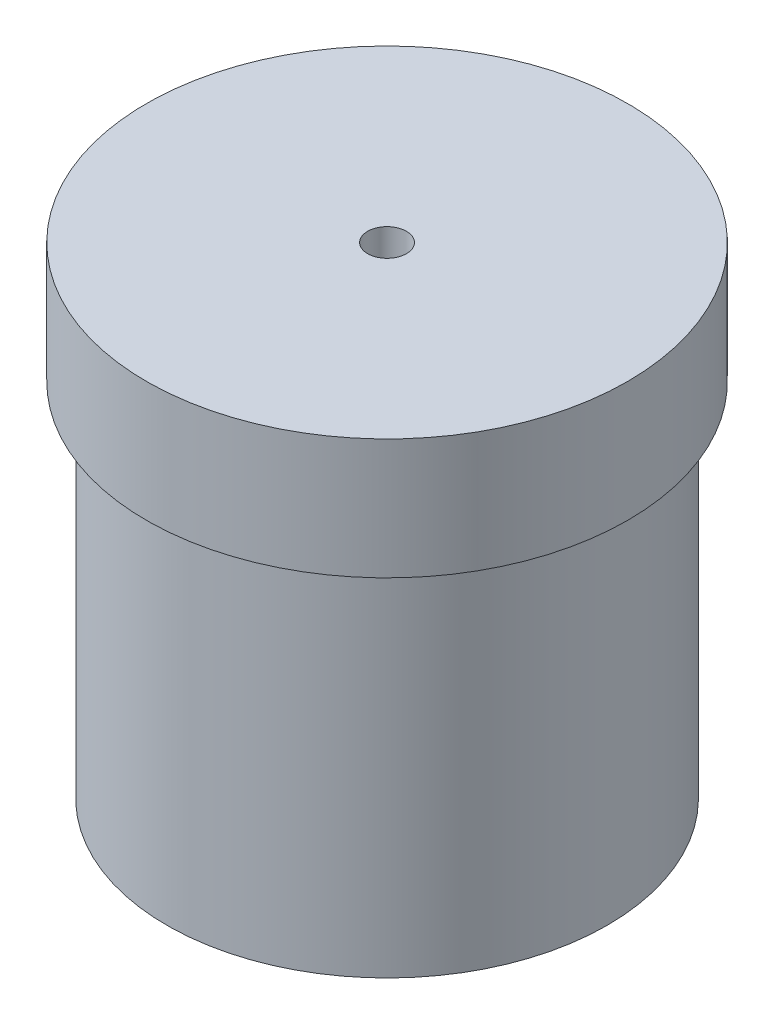
ISO-10303-21;
HEADER;
FILE_DESCRIPTION(('STEP AP214'),'2;1');
FILE_NAME('part.step','',(''),(''),'','','');
FILE_SCHEMA(('AUTOMOTIVE_DESIGN { 1 0 10303 214 1 1 1 1 }'));
ENDSEC;
DATA;
#1=APPLICATION_CONTEXT('core data for automotive mechanical design processes');
#2=APPLICATION_PROTOCOL_DEFINITION('international standard','automotive_design',2000,#1);
#3=PRODUCT_CONTEXT('',#1,'mechanical');
#4=PRODUCT('Part','Part','',(#3));
#5=PRODUCT_RELATED_PRODUCT_CATEGORY('part','',(#4));
#6=PRODUCT_DEFINITION_FORMATION('','',#4);
#7=PRODUCT_DEFINITION_CONTEXT('part definition',#1,'design');
#8=PRODUCT_DEFINITION('design','',#6,#7);
#9=PRODUCT_DEFINITION_SHAPE('','',#8);
#10=(LENGTH_UNIT() NAMED_UNIT(*) SI_UNIT(.MILLI.,.METRE.));
#11=(NAMED_UNIT(*) PLANE_ANGLE_UNIT() SI_UNIT($,.RADIAN.));
#12=(NAMED_UNIT(*) SI_UNIT($,.STERADIAN.) SOLID_ANGLE_UNIT());
#13=UNCERTAINTY_MEASURE_WITH_UNIT(LENGTH_MEASURE(1.E-05),#10,'distance_accuracy_value','');
#14=(GEOMETRIC_REPRESENTATION_CONTEXT(3) GLOBAL_UNCERTAINTY_ASSIGNED_CONTEXT((#13)) GLOBAL_UNIT_ASSIGNED_CONTEXT((#10,
#11,#12)) REPRESENTATION_CONTEXT('',''));
#15=CARTESIAN_POINT('',(0.,0.,0.));
#16=DIRECTION('',(0.,0.,1.));
#17=DIRECTION('',(1.,0.,0.));
#18=AXIS2_PLACEMENT_3D('',#15,#16,#17);
#19=CARTESIAN_POINT('',(0.,12.7,0.));
#20=DIRECTION('',(0.,-1.,0.));
#21=DIRECTION('',(1.,0.,0.));
#22=AXIS2_PLACEMENT_3D('',#19,#20,#21);
#23=PLANE('',#22);
#24=CARTESIAN_POINT('',(0.,12.7,0.));
#25=DIRECTION('',(0.,1.,0.));
#26=DIRECTION('',(0.,0.,1.));
#27=AXIS2_PLACEMENT_3D('',#24,#25,#26);
#28=CIRCLE('',#27,1.025);
#29=CARTESIAN_POINT('',(0.,12.7,1.025));
#30=VERTEX_POINT('',#29);
#31=EDGE_CURVE('E60',#30,#30,#28,.T.);
#32=ORIENTED_EDGE('',*,*,#31,.F.);
#33=EDGE_LOOP('',(#32));
#34=FACE_BOUND('',#33,.T.);
#35=CARTESIAN_POINT('',(0.,12.7,0.));
#36=DIRECTION('',(0.,-1.,0.));
#37=DIRECTION('',(1.,0.,0.));
#38=AXIS2_PLACEMENT_3D('',#35,#36,#37);
#39=CIRCLE('',#38,12.7);
#40=CARTESIAN_POINT('',(12.7,12.7,0.));
#41=VERTEX_POINT('',#40);
#42=EDGE_CURVE('E11',#41,#41,#39,.T.);
#43=ORIENTED_EDGE('',*,*,#42,.F.);
#44=EDGE_LOOP('',(#43));
#45=FACE_BOUND('',#44,.T.);
#46=ADVANCED_FACE('F40',(#34,#45),#23,.F.);
#47=CARTESIAN_POINT('',(0.,-12.7,0.));
#48=DIRECTION('',(0.,-1.,0.));
#49=DIRECTION('',(1.,0.,0.));
#50=AXIS2_PLACEMENT_3D('',#47,#48,#49);
#51=CYLINDRICAL_SURFACE('',#50,12.7);
#52=CARTESIAN_POINT('',(0.,6.35,0.));
#53=DIRECTION('',(0.,-1.,0.));
#54=DIRECTION('',(1.,0.,0.));
#55=AXIS2_PLACEMENT_3D('',#52,#53,#54);
#56=CIRCLE('',#55,12.7);
#57=CARTESIAN_POINT('',(12.7,6.35000000000001,0.));
#58=VERTEX_POINT('',#57);
#59=EDGE_CURVE('E46',#58,#58,#56,.T.);
#60=ORIENTED_EDGE('',*,*,#59,.F.);
#61=EDGE_LOOP('',(#60));
#62=FACE_BOUND('',#61,.T.);
#63=ORIENTED_EDGE('',*,*,#42,.T.);
#64=EDGE_LOOP('',(#63));
#65=FACE_BOUND('',#64,.T.);
#66=ADVANCED_FACE('F74',(#62,#65),#51,.T.);
#67=CARTESIAN_POINT('',(-12.7,6.35,0.));
#68=DIRECTION('',(0.,1.,0.));
#69=DIRECTION('',(-1.,0.,0.));
#70=AXIS2_PLACEMENT_3D('',#67,#68,#69);
#71=PLANE('',#70);
#72=CARTESIAN_POINT('',(0.,6.35,0.));
#73=DIRECTION('',(0.,-1.,0.));
#74=DIRECTION('',(1.,0.,0.));
#75=AXIS2_PLACEMENT_3D('',#72,#73,#74);
#76=CIRCLE('',#75,11.6205);
#77=CARTESIAN_POINT('',(11.6205,6.35,0.));
#78=VERTEX_POINT('',#77);
#79=EDGE_CURVE('E63',#78,#78,#76,.T.);
#80=ORIENTED_EDGE('',*,*,#79,.F.);
#81=EDGE_LOOP('',(#80));
#82=FACE_BOUND('',#81,.T.);
#83=ORIENTED_EDGE('',*,*,#59,.T.);
#84=EDGE_LOOP('',(#83));
#85=FACE_BOUND('',#84,.T.);
#86=ADVANCED_FACE('F72',(#82,#85),#71,.F.);
#87=CARTESIAN_POINT('',(0.,-12.7,0.));
#88=DIRECTION('',(0.,-1.,0.));
#89=DIRECTION('',(1.,0.,0.));
#90=AXIS2_PLACEMENT_3D('',#87,#88,#89);
#91=CYLINDRICAL_SURFACE('',#90,11.6205);
#92=CARTESIAN_POINT('',(0.,-12.7,0.));
#93=DIRECTION('',(0.,-1.,0.));
#94=DIRECTION('',(1.,0.,0.));
#95=AXIS2_PLACEMENT_3D('',#92,#93,#94);
#96=CIRCLE('',#95,11.6205);
#97=CARTESIAN_POINT('',(11.6205,-12.7,0.));
#98=VERTEX_POINT('',#97);
#99=EDGE_CURVE('E59',#98,#98,#96,.T.);
#100=ORIENTED_EDGE('',*,*,#99,.F.);
#101=EDGE_LOOP('',(#100));
#102=FACE_BOUND('',#101,.T.);
#103=ORIENTED_EDGE('',*,*,#79,.T.);
#104=EDGE_LOOP('',(#103));
#105=FACE_BOUND('',#104,.T.);
#106=ADVANCED_FACE('F92',(#102,#105),#91,.T.);
#107=CARTESIAN_POINT('',(-11.6205,-12.7,0.));
#108=DIRECTION('',(0.,1.,0.));
#109=DIRECTION('',(-1.,0.,0.));
#110=AXIS2_PLACEMENT_3D('',#107,#108,#109);
#111=PLANE('',#110);
#112=ORIENTED_EDGE('',*,*,#99,.T.);
#113=EDGE_LOOP('',(#112));
#114=FACE_BOUND('',#113,.T.);
#115=ADVANCED_FACE('F53',(#114),#111,.F.);
#116=CARTESIAN_POINT('',(0.,6.35,0.));
#117=DIRECTION('',(0.,1.,0.));
#118=DIRECTION('',(0.,0.,1.));
#119=AXIS2_PLACEMENT_3D('',#116,#117,#118);
#120=CONICAL_SURFACE('',#119,1.025,1.02974425867665);
#121=CARTESIAN_POINT('',(0.,5.73411786549676,0.));
#122=VERTEX_POINT('',#121);
#123=VERTEX_LOOP('',#122);
#124=FACE_BOUND('',#123,.T.);
#125=CARTESIAN_POINT('',(0.,6.35,0.));
#126=DIRECTION('',(0.,1.,0.));
#127=DIRECTION('',(0.,0.,1.));
#128=AXIS2_PLACEMENT_3D('',#125,#126,#127);
#129=CIRCLE('',#128,1.025);
#130=CARTESIAN_POINT('',(0.,6.35,1.025));
#131=VERTEX_POINT('',#130);
#132=EDGE_CURVE('E57',#131,#131,#129,.T.);
#133=ORIENTED_EDGE('',*,*,#132,.T.);
#134=EDGE_LOOP('',(#133));
#135=FACE_BOUND('',#134,.T.);
#136=ADVANCED_FACE('F49',(#124,#135),#120,.F.);
#137=CARTESIAN_POINT('',(0.,12.7,0.));
#138=DIRECTION('',(0.,1.,0.));
#139=DIRECTION('',(0.,0.,1.));
#140=AXIS2_PLACEMENT_3D('',#137,#138,#139);
#141=CYLINDRICAL_SURFACE('',#140,1.025);
#142=ORIENTED_EDGE('',*,*,#132,.F.);
#143=EDGE_LOOP('',(#142));
#144=FACE_BOUND('',#143,.T.);
#145=ORIENTED_EDGE('',*,*,#31,.T.);
#146=EDGE_LOOP('',(#145));
#147=FACE_BOUND('',#146,.T.);
#148=ADVANCED_FACE('F52',(#144,#147),#141,.F.);
#149=CLOSED_SHELL('',(#46,#66,#86,#106,#115,#136,#148));
#150=MANIFOLD_SOLID_BREP('B2',#149);
#151=ADVANCED_BREP_SHAPE_REPRESENTATION('',(#18,#150),#14);
#152=SHAPE_DEFINITION_REPRESENTATION(#9,#151);
ENDSEC;
END-ISO-10303-21;
